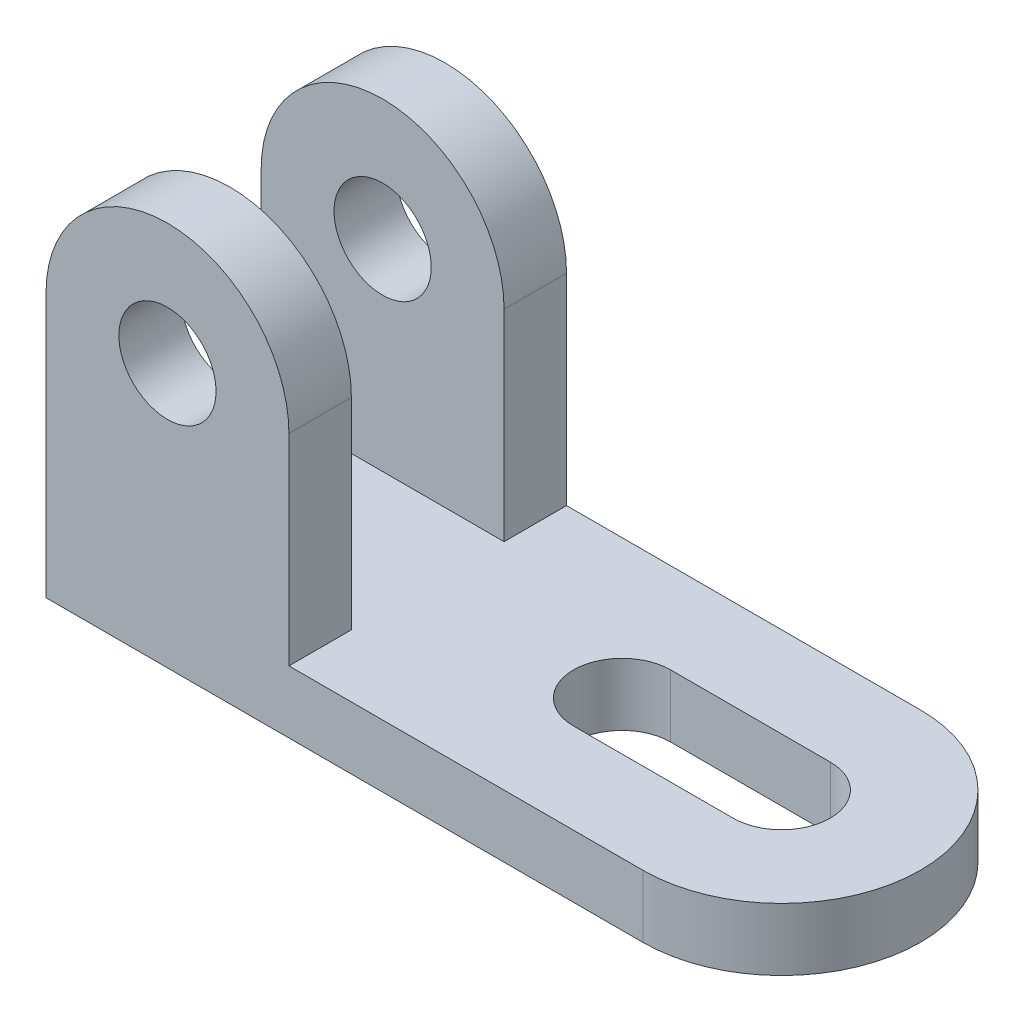
ISO-10303-21;
HEADER;
FILE_DESCRIPTION(('STEP AP214'),'2;1');
FILE_NAME('part.step','',(''),(''),'','','');
FILE_SCHEMA(('AUTOMOTIVE_DESIGN { 1 0 10303 214 1 1 1 1 }'));
ENDSEC;
DATA;
#1=APPLICATION_CONTEXT('core data for automotive mechanical design processes');
#2=APPLICATION_PROTOCOL_DEFINITION('international standard','automotive_design',2000,#1);
#3=PRODUCT_CONTEXT('',#1,'mechanical');
#4=PRODUCT('Part','Part','',(#3));
#5=PRODUCT_RELATED_PRODUCT_CATEGORY('part','',(#4));
#6=PRODUCT_DEFINITION_FORMATION('','',#4);
#7=PRODUCT_DEFINITION_CONTEXT('part definition',#1,'design');
#8=PRODUCT_DEFINITION('design','',#6,#7);
#9=PRODUCT_DEFINITION_SHAPE('','',#8);
#10=(LENGTH_UNIT() NAMED_UNIT(*) SI_UNIT(.MILLI.,.METRE.));
#11=(NAMED_UNIT(*) PLANE_ANGLE_UNIT() SI_UNIT($,.RADIAN.));
#12=(NAMED_UNIT(*) SI_UNIT($,.STERADIAN.) SOLID_ANGLE_UNIT());
#13=UNCERTAINTY_MEASURE_WITH_UNIT(LENGTH_MEASURE(1.E-05),#10,'distance_accuracy_value','');
#14=(GEOMETRIC_REPRESENTATION_CONTEXT(3) GLOBAL_UNCERTAINTY_ASSIGNED_CONTEXT((#13)) GLOBAL_UNIT_ASSIGNED_CONTEXT((#10,
#11,#12)) REPRESENTATION_CONTEXT('',''));
#15=CARTESIAN_POINT('',(0.,0.,0.));
#16=DIRECTION('',(0.,0.,1.));
#17=DIRECTION('',(1.,0.,0.));
#18=AXIS2_PLACEMENT_3D('',#15,#16,#17);
#19=CARTESIAN_POINT('',(0.,9.,0.));
#20=DIRECTION('',(0.,1.,0.));
#21=DIRECTION('',(0.,0.,1.));
#22=AXIS2_PLACEMENT_3D('',#19,#20,#21);
#23=PLANE('',#22);
#24=DIRECTION('',(0.,0.,-1.));
#25=VECTOR('',#24,1.);
#26=CARTESIAN_POINT('',(-51.,9.,0.));
#27=LINE('',#26,#25);
#28=CARTESIAN_POINT('',(-51.,9.,-11.));
#29=VERTEX_POINT('',#28);
#30=CARTESIAN_POINT('',(-51.,9.,-20.));
#31=VERTEX_POINT('',#30);
#32=EDGE_CURVE('E11',#29,#31,#27,.T.);
#33=ORIENTED_EDGE('',*,*,#32,.F.);
#34=DIRECTION('',(-1.,0.,0.));
#35=VECTOR('',#34,1.);
#36=CARTESIAN_POINT('',(0.,9.,-11.));
#37=LINE('',#36,#35);
#38=CARTESIAN_POINT('',(-86.,9.,-11.));
#39=VERTEX_POINT('',#38);
#40=EDGE_CURVE('E167',#29,#39,#37,.T.);
#41=ORIENTED_EDGE('',*,*,#40,.T.);
#42=DIRECTION('',(0.,0.,1.));
#43=VECTOR('',#42,1.);
#44=CARTESIAN_POINT('',(-86.,9.,-20.));
#45=LINE('',#44,#43);
#46=CARTESIAN_POINT('',(-86.,9.,11.));
#47=VERTEX_POINT('',#46);
#48=EDGE_CURVE('E149',#39,#47,#45,.T.);
#49=ORIENTED_EDGE('',*,*,#48,.T.);
#50=DIRECTION('',(1.,0.,0.));
#51=VECTOR('',#50,1.);
#52=CARTESIAN_POINT('',(0.,9.,11.));
#53=LINE('',#52,#51);
#54=CARTESIAN_POINT('',(-51.,9.,11.));
#55=VERTEX_POINT('',#54);
#56=EDGE_CURVE('E254',#47,#55,#53,.T.);
#57=ORIENTED_EDGE('',*,*,#56,.T.);
#58=DIRECTION('',(0.,0.,1.));
#59=VECTOR('',#58,1.);
#60=CARTESIAN_POINT('',(-51.,9.,0.));
#61=LINE('',#60,#59);
#62=CARTESIAN_POINT('',(-51.,9.,20.));
#63=VERTEX_POINT('',#62);
#64=EDGE_CURVE('E47',#55,#63,#61,.T.);
#65=ORIENTED_EDGE('',*,*,#64,.T.);
#66=DIRECTION('',(1.,0.,0.));
#67=VECTOR('',#66,1.);
#68=CARTESIAN_POINT('',(0.,9.,20.));
#69=LINE('',#68,#67);
#70=CARTESIAN_POINT('',(0.,9.,20.));
#71=VERTEX_POINT('',#70);
#72=EDGE_CURVE('E233',#63,#71,#69,.T.);
#73=ORIENTED_EDGE('',*,*,#72,.T.);
#74=CARTESIAN_POINT('',(0.,9.,0.));
#75=DIRECTION('',(0.,1.,0.));
#76=DIRECTION('',(0.,0.,1.));
#77=AXIS2_PLACEMENT_3D('',#74,#75,#76);
#78=CIRCLE('',#77,20.);
#79=CARTESIAN_POINT('',(0.,9.,-20.));
#80=VERTEX_POINT('',#79);
#81=EDGE_CURVE('E230',#71,#80,#78,.T.);
#82=ORIENTED_EDGE('',*,*,#81,.T.);
#83=DIRECTION('',(-1.,0.,0.));
#84=VECTOR('',#83,1.);
#85=CARTESIAN_POINT('',(0.,9.,-20.));
#86=LINE('',#85,#84);
#87=EDGE_CURVE('E228',#80,#31,#86,.T.);
#88=ORIENTED_EDGE('',*,*,#87,.T.);
#89=EDGE_LOOP('',(#33,#41,#49,#57,#65,#73,#82,#88));
#90=FACE_BOUND('',#89,.T.);
#91=DIRECTION('',(1.,0.,0.));
#92=VECTOR('',#91,1.);
#93=CARTESIAN_POINT('',(-23.,9.,7.));
#94=LINE('',#93,#92);
#95=CARTESIAN_POINT('',(-23.,9.,7.));
#96=VERTEX_POINT('',#95);
#97=CARTESIAN_POINT('',(0.,9.,7.));
#98=VERTEX_POINT('',#97);
#99=EDGE_CURVE('E196',#96,#98,#94,.T.);
#100=ORIENTED_EDGE('',*,*,#99,.F.);
#101=CARTESIAN_POINT('',(-23.,9.,0.));
#102=DIRECTION('',(0.,1.,0.));
#103=DIRECTION('',(0.,0.,1.));
#104=AXIS2_PLACEMENT_3D('',#101,#102,#103);
#105=CIRCLE('',#104,7.);
#106=CARTESIAN_POINT('',(-23.,9.,-7.));
#107=VERTEX_POINT('',#106);
#108=EDGE_CURVE('E198',#107,#96,#105,.T.);
#109=ORIENTED_EDGE('',*,*,#108,.F.);
#110=DIRECTION('',(-1.,0.,0.));
#111=VECTOR('',#110,1.);
#112=CARTESIAN_POINT('',(-23.,9.,-7.));
#113=LINE('',#112,#111);
#114=CARTESIAN_POINT('',(0.,9.,-7.));
#115=VERTEX_POINT('',#114);
#116=EDGE_CURVE('E204',#115,#107,#113,.T.);
#117=ORIENTED_EDGE('',*,*,#116,.F.);
#118=CARTESIAN_POINT('',(0.,9.,0.));
#119=DIRECTION('',(0.,1.,0.));
#120=DIRECTION('',(0.,0.,1.));
#121=AXIS2_PLACEMENT_3D('',#118,#119,#120);
#122=CIRCLE('',#121,7.);
#123=EDGE_CURVE('E203',#98,#115,#122,.T.);
#124=ORIENTED_EDGE('',*,*,#123,.F.);
#125=EDGE_LOOP('',(#100,#109,#117,#124));
#126=FACE_BOUND('',#125,.T.);
#127=ADVANCED_FACE('F41',(#90,#126),#23,.T.);
#128=CARTESIAN_POINT('',(0.,0.,0.));
#129=DIRECTION('',(0.,1.,0.));
#130=DIRECTION('',(0.,0.,1.));
#131=AXIS2_PLACEMENT_3D('',#128,#129,#130);
#132=PLANE('',#131);
#133=DIRECTION('',(0.,0.,1.));
#134=VECTOR('',#133,1.);
#135=CARTESIAN_POINT('',(-86.,0.,-20.));
#136=LINE('',#135,#134);
#137=CARTESIAN_POINT('',(-86.,0.,-20.));
#138=VERTEX_POINT('',#137);
#139=CARTESIAN_POINT('',(-86.,0.,20.));
#140=VERTEX_POINT('',#139);
#141=EDGE_CURVE('E245',#138,#140,#136,.T.);
#142=ORIENTED_EDGE('',*,*,#141,.F.);
#143=DIRECTION('',(-1.,0.,0.));
#144=VECTOR('',#143,1.);
#145=CARTESIAN_POINT('',(0.,0.,-20.));
#146=LINE('',#145,#144);
#147=CARTESIAN_POINT('',(0.,0.,-20.));
#148=VERTEX_POINT('',#147);
#149=EDGE_CURVE('E238',#148,#138,#146,.T.);
#150=ORIENTED_EDGE('',*,*,#149,.F.);
#151=CARTESIAN_POINT('',(0.,0.,0.));
#152=DIRECTION('',(0.,1.,0.));
#153=DIRECTION('',(0.,0.,1.));
#154=AXIS2_PLACEMENT_3D('',#151,#152,#153);
#155=CIRCLE('',#154,20.);
#156=CARTESIAN_POINT('',(0.,0.,20.));
#157=VERTEX_POINT('',#156);
#158=EDGE_CURVE('E227',#157,#148,#155,.T.);
#159=ORIENTED_EDGE('',*,*,#158,.F.);
#160=DIRECTION('',(1.,0.,0.));
#161=VECTOR('',#160,1.);
#162=CARTESIAN_POINT('',(0.,0.,20.));
#163=LINE('',#162,#161);
#164=EDGE_CURVE('E232',#140,#157,#163,.T.);
#165=ORIENTED_EDGE('',*,*,#164,.F.);
#166=EDGE_LOOP('',(#142,#150,#159,#165));
#167=FACE_BOUND('',#166,.T.);
#168=CARTESIAN_POINT('',(-23.,0.,0.));
#169=DIRECTION('',(0.,1.,0.));
#170=DIRECTION('',(0.,0.,1.));
#171=AXIS2_PLACEMENT_3D('',#168,#169,#170);
#172=CIRCLE('',#171,7.);
#173=CARTESIAN_POINT('',(-23.,0.,-7.));
#174=VERTEX_POINT('',#173);
#175=CARTESIAN_POINT('',(-23.,0.,7.));
#176=VERTEX_POINT('',#175);
#177=EDGE_CURVE('E191',#174,#176,#172,.T.);
#178=ORIENTED_EDGE('',*,*,#177,.T.);
#179=DIRECTION('',(1.,0.,0.));
#180=VECTOR('',#179,1.);
#181=CARTESIAN_POINT('',(-23.,0.,7.));
#182=LINE('',#181,#180);
#183=CARTESIAN_POINT('',(0.,0.,7.));
#184=VERTEX_POINT('',#183);
#185=EDGE_CURVE('E207',#176,#184,#182,.T.);
#186=ORIENTED_EDGE('',*,*,#185,.T.);
#187=CARTESIAN_POINT('',(0.,0.,0.));
#188=DIRECTION('',(0.,1.,0.));
#189=DIRECTION('',(0.,0.,1.));
#190=AXIS2_PLACEMENT_3D('',#187,#188,#189);
#191=CIRCLE('',#190,7.);
#192=CARTESIAN_POINT('',(0.,0.,-7.));
#193=VERTEX_POINT('',#192);
#194=EDGE_CURVE('E215',#184,#193,#191,.T.);
#195=ORIENTED_EDGE('',*,*,#194,.T.);
#196=DIRECTION('',(-1.,0.,0.));
#197=VECTOR('',#196,1.);
#198=CARTESIAN_POINT('',(-23.,0.,-7.));
#199=LINE('',#198,#197);
#200=EDGE_CURVE('E200',#193,#174,#199,.T.);
#201=ORIENTED_EDGE('',*,*,#200,.T.);
#202=EDGE_LOOP('',(#178,#186,#195,#201));
#203=FACE_BOUND('',#202,.T.);
#204=ADVANCED_FACE('F302',(#167,#203),#132,.F.);
#205=CARTESIAN_POINT('',(0.,9.,0.));
#206=DIRECTION('',(0.,-1.,0.));
#207=DIRECTION('',(0.,0.,-1.));
#208=AXIS2_PLACEMENT_3D('',#205,#206,#207);
#209=CYLINDRICAL_SURFACE('',#208,20.);
#210=ORIENTED_EDGE('',*,*,#158,.T.);
#211=DIRECTION('',(0.,-1.,0.));
#212=VECTOR('',#211,1.);
#213=CARTESIAN_POINT('',(0.,9.,-20.));
#214=LINE('',#213,#212);
#215=EDGE_CURVE('E252',#80,#148,#214,.T.);
#216=ORIENTED_EDGE('',*,*,#215,.F.);
#217=ORIENTED_EDGE('',*,*,#81,.F.);
#218=DIRECTION('',(0.,-1.,0.));
#219=VECTOR('',#218,1.);
#220=CARTESIAN_POINT('',(0.,9.,20.));
#221=LINE('',#220,#219);
#222=EDGE_CURVE('E240',#71,#157,#221,.T.);
#223=ORIENTED_EDGE('',*,*,#222,.T.);
#224=EDGE_LOOP('',(#210,#216,#217,#223));
#225=FACE_BOUND('',#224,.T.);
#226=ADVANCED_FACE('F43',(#225),#209,.T.);
#227=CARTESIAN_POINT('',(0.,9.,-20.));
#228=DIRECTION('',(0.,0.,1.));
#229=DIRECTION('',(1.,0.,0.));
#230=AXIS2_PLACEMENT_3D('',#227,#228,#229);
#231=PLANE('',#230);
#232=DIRECTION('',(0.,-1.,0.));
#233=VECTOR('',#232,1.);
#234=CARTESIAN_POINT('',(-86.,9.,-20.));
#235=LINE('',#234,#233);
#236=CARTESIAN_POINT('',(-86.,38.,-20.));
#237=VERTEX_POINT('',#236);
#238=EDGE_CURVE('E248',#237,#138,#235,.T.);
#239=ORIENTED_EDGE('',*,*,#238,.F.);
#240=CARTESIAN_POINT('',(-68.5,38.,-20.));
#241=DIRECTION('',(0.,0.,1.));
#242=DIRECTION('',(1.,0.,0.));
#243=AXIS2_PLACEMENT_3D('',#240,#241,#242);
#244=CIRCLE('',#243,17.5);
#245=CARTESIAN_POINT('',(-51.,38.,-20.));
#246=VERTEX_POINT('',#245);
#247=EDGE_CURVE('E162',#246,#237,#244,.T.);
#248=ORIENTED_EDGE('',*,*,#247,.F.);
#249=DIRECTION('',(0.,-1.,0.));
#250=VECTOR('',#249,1.);
#251=CARTESIAN_POINT('',(-51.,0.,-20.));
#252=LINE('',#251,#250);
#253=EDGE_CURVE('E276',#246,#31,#252,.T.);
#254=ORIENTED_EDGE('',*,*,#253,.T.);
#255=ORIENTED_EDGE('',*,*,#87,.F.);
#256=ORIENTED_EDGE('',*,*,#215,.T.);
#257=ORIENTED_EDGE('',*,*,#149,.T.);
#258=EDGE_LOOP('',(#239,#248,#254,#255,#256,#257));
#259=FACE_BOUND('',#258,.T.);
#260=CARTESIAN_POINT('',(-68.5,38.,-20.));
#261=DIRECTION('',(0.,0.,1.));
#262=DIRECTION('',(1.,0.,0.));
#263=AXIS2_PLACEMENT_3D('',#260,#261,#262);
#264=CIRCLE('',#263,7.);
#265=CARTESIAN_POINT('',(-61.5,38.,-20.));
#266=VERTEX_POINT('',#265);
#267=EDGE_CURVE('E285',#266,#266,#264,.T.);
#268=ORIENTED_EDGE('',*,*,#267,.T.);
#269=EDGE_LOOP('',(#268));
#270=FACE_BOUND('',#269,.T.);
#271=ADVANCED_FACE('F277',(#259,#270),#231,.F.);
#272=CARTESIAN_POINT('',(-86.,9.,-20.));
#273=DIRECTION('',(1.,0.,0.));
#274=DIRECTION('',(0.,0.,-1.));
#275=AXIS2_PLACEMENT_3D('',#272,#273,#274);
#276=PLANE('',#275);
#277=ORIENTED_EDGE('',*,*,#141,.T.);
#278=DIRECTION('',(0.,-1.,0.));
#279=VECTOR('',#278,1.);
#280=CARTESIAN_POINT('',(-86.,9.,20.));
#281=LINE('',#280,#279);
#282=CARTESIAN_POINT('',(-86.,38.,20.));
#283=VERTEX_POINT('',#282);
#284=EDGE_CURVE('E250',#283,#140,#281,.T.);
#285=ORIENTED_EDGE('',*,*,#284,.F.);
#286=DIRECTION('',(0.,0.,1.));
#287=VECTOR('',#286,1.);
#288=CARTESIAN_POINT('',(-86.,38.,11.));
#289=LINE('',#288,#287);
#290=CARTESIAN_POINT('',(-86.,38.,11.));
#291=VERTEX_POINT('',#290);
#292=EDGE_CURVE('E192',#291,#283,#289,.T.);
#293=ORIENTED_EDGE('',*,*,#292,.F.);
#294=DIRECTION('',(0.,1.,0.));
#295=VECTOR('',#294,1.);
#296=CARTESIAN_POINT('',(-86.,0.,11.));
#297=LINE('',#296,#295);
#298=EDGE_CURVE('E176',#47,#291,#297,.T.);
#299=ORIENTED_EDGE('',*,*,#298,.F.);
#300=ORIENTED_EDGE('',*,*,#48,.F.);
#301=DIRECTION('',(0.,1.,0.));
#302=VECTOR('',#301,1.);
#303=CARTESIAN_POINT('',(-86.,0.,-11.));
#304=LINE('',#303,#302);
#305=CARTESIAN_POINT('',(-86.,38.,-11.));
#306=VERTEX_POINT('',#305);
#307=EDGE_CURVE('E57',#39,#306,#304,.T.);
#308=ORIENTED_EDGE('',*,*,#307,.T.);
#309=DIRECTION('',(0.,0.,-1.));
#310=VECTOR('',#309,1.);
#311=CARTESIAN_POINT('',(-86.,38.,-11.));
#312=LINE('',#311,#310);
#313=EDGE_CURVE('E148',#306,#237,#312,.T.);
#314=ORIENTED_EDGE('',*,*,#313,.T.);
#315=ORIENTED_EDGE('',*,*,#238,.T.);
#316=EDGE_LOOP('',(#277,#285,#293,#299,#300,#308,#314,#315));
#317=FACE_BOUND('',#316,.T.);
#318=ADVANCED_FACE('F141',(#317),#276,.F.);
#319=CARTESIAN_POINT('',(0.,9.,20.));
#320=DIRECTION('',(0.,0.,-1.));
#321=DIRECTION('',(-1.,0.,0.));
#322=AXIS2_PLACEMENT_3D('',#319,#320,#321);
#323=PLANE('',#322);
#324=ORIENTED_EDGE('',*,*,#72,.F.);
#325=DIRECTION('',(0.,-1.,0.));
#326=VECTOR('',#325,1.);
#327=CARTESIAN_POINT('',(-51.,0.,20.));
#328=LINE('',#327,#326);
#329=CARTESIAN_POINT('',(-51.,38.,20.));
#330=VERTEX_POINT('',#329);
#331=EDGE_CURVE('E174',#330,#63,#328,.T.);
#332=ORIENTED_EDGE('',*,*,#331,.F.);
#333=CARTESIAN_POINT('',(-68.5,38.,20.));
#334=DIRECTION('',(0.,0.,1.));
#335=DIRECTION('',(1.,0.,0.));
#336=AXIS2_PLACEMENT_3D('',#333,#334,#335);
#337=CIRCLE('',#336,17.5);
#338=EDGE_CURVE('E187',#330,#283,#337,.T.);
#339=ORIENTED_EDGE('',*,*,#338,.T.);
#340=ORIENTED_EDGE('',*,*,#284,.T.);
#341=ORIENTED_EDGE('',*,*,#164,.T.);
#342=ORIENTED_EDGE('',*,*,#222,.F.);
#343=EDGE_LOOP('',(#324,#332,#339,#340,#341,#342));
#344=FACE_BOUND('',#343,.T.);
#345=CARTESIAN_POINT('',(-68.5,38.,20.));
#346=DIRECTION('',(0.,0.,1.));
#347=DIRECTION('',(1.,0.,0.));
#348=AXIS2_PLACEMENT_3D('',#345,#346,#347);
#349=CIRCLE('',#348,7.);
#350=CARTESIAN_POINT('',(-61.5,38.,20.));
#351=VERTEX_POINT('',#350);
#352=EDGE_CURVE('E177',#351,#351,#349,.T.);
#353=ORIENTED_EDGE('',*,*,#352,.F.);
#354=EDGE_LOOP('',(#353));
#355=FACE_BOUND('',#354,.T.);
#356=ADVANCED_FACE('F266',(#344,#355),#323,.F.);
#357=CARTESIAN_POINT('',(-23.,9.,0.));
#358=DIRECTION('',(0.,-1.,0.));
#359=DIRECTION('',(0.,0.,-1.));
#360=AXIS2_PLACEMENT_3D('',#357,#358,#359);
#361=CYLINDRICAL_SURFACE('',#360,7.);
#362=ORIENTED_EDGE('',*,*,#177,.F.);
#363=DIRECTION('',(0.,-1.,0.));
#364=VECTOR('',#363,1.);
#365=CARTESIAN_POINT('',(-23.,9.,-7.));
#366=LINE('',#365,#364);
#367=EDGE_CURVE('E206',#107,#174,#366,.T.);
#368=ORIENTED_EDGE('',*,*,#367,.F.);
#369=ORIENTED_EDGE('',*,*,#108,.T.);
#370=DIRECTION('',(0.,-1.,0.));
#371=VECTOR('',#370,1.);
#372=CARTESIAN_POINT('',(-23.,9.,7.));
#373=LINE('',#372,#371);
#374=EDGE_CURVE('E224',#96,#176,#373,.T.);
#375=ORIENTED_EDGE('',*,*,#374,.T.);
#376=EDGE_LOOP('',(#362,#368,#369,#375));
#377=FACE_BOUND('',#376,.T.);
#378=ADVANCED_FACE('F310',(#377),#361,.F.);
#379=CARTESIAN_POINT('',(-23.,9.,7.));
#380=DIRECTION('',(0.,0.,-1.));
#381=DIRECTION('',(-1.,0.,0.));
#382=AXIS2_PLACEMENT_3D('',#379,#380,#381);
#383=PLANE('',#382);
#384=ORIENTED_EDGE('',*,*,#185,.F.);
#385=ORIENTED_EDGE('',*,*,#374,.F.);
#386=ORIENTED_EDGE('',*,*,#99,.T.);
#387=DIRECTION('',(0.,-1.,0.));
#388=VECTOR('',#387,1.);
#389=CARTESIAN_POINT('',(0.,9.,7.));
#390=LINE('',#389,#388);
#391=EDGE_CURVE('E222',#98,#184,#390,.T.);
#392=ORIENTED_EDGE('',*,*,#391,.T.);
#393=EDGE_LOOP('',(#384,#385,#386,#392));
#394=FACE_BOUND('',#393,.T.);
#395=ADVANCED_FACE('F328',(#394),#383,.T.);
#396=CARTESIAN_POINT('',(0.,9.,0.));
#397=DIRECTION('',(0.,-1.,0.));
#398=DIRECTION('',(0.,0.,-1.));
#399=AXIS2_PLACEMENT_3D('',#396,#397,#398);
#400=CYLINDRICAL_SURFACE('',#399,7.);
#401=ORIENTED_EDGE('',*,*,#194,.F.);
#402=ORIENTED_EDGE('',*,*,#391,.F.);
#403=ORIENTED_EDGE('',*,*,#123,.T.);
#404=DIRECTION('',(0.,-1.,0.));
#405=VECTOR('',#404,1.);
#406=CARTESIAN_POINT('',(0.,9.,-7.));
#407=LINE('',#406,#405);
#408=EDGE_CURVE('E218',#115,#193,#407,.T.);
#409=ORIENTED_EDGE('',*,*,#408,.T.);
#410=EDGE_LOOP('',(#401,#402,#403,#409));
#411=FACE_BOUND('',#410,.T.);
#412=ADVANCED_FACE('F339',(#411),#400,.F.);
#413=CARTESIAN_POINT('',(-23.,9.,-7.));
#414=DIRECTION('',(0.,0.,1.));
#415=DIRECTION('',(1.,0.,0.));
#416=AXIS2_PLACEMENT_3D('',#413,#414,#415);
#417=PLANE('',#416);
#418=ORIENTED_EDGE('',*,*,#200,.F.);
#419=ORIENTED_EDGE('',*,*,#408,.F.);
#420=ORIENTED_EDGE('',*,*,#116,.T.);
#421=ORIENTED_EDGE('',*,*,#367,.T.);
#422=EDGE_LOOP('',(#418,#419,#420,#421));
#423=FACE_BOUND('',#422,.T.);
#424=ADVANCED_FACE('F347',(#423),#417,.T.);
#425=CARTESIAN_POINT('',(-51.,0.,11.));
#426=DIRECTION('',(-1.,0.,0.));
#427=DIRECTION('',(0.,0.,1.));
#428=AXIS2_PLACEMENT_3D('',#425,#426,#427);
#429=PLANE('',#428);
#430=ORIENTED_EDGE('',*,*,#64,.F.);
#431=DIRECTION('',(0.,-1.,0.));
#432=VECTOR('',#431,1.);
#433=CARTESIAN_POINT('',(-51.,0.,11.));
#434=LINE('',#433,#432);
#435=CARTESIAN_POINT('',(-51.,38.,11.));
#436=VERTEX_POINT('',#435);
#437=EDGE_CURVE('E61',#436,#55,#434,.T.);
#438=ORIENTED_EDGE('',*,*,#437,.F.);
#439=DIRECTION('',(0.,0.,1.));
#440=VECTOR('',#439,1.);
#441=CARTESIAN_POINT('',(-51.,38.,11.));
#442=LINE('',#441,#440);
#443=EDGE_CURVE('E184',#436,#330,#442,.T.);
#444=ORIENTED_EDGE('',*,*,#443,.T.);
#445=ORIENTED_EDGE('',*,*,#331,.T.);
#446=EDGE_LOOP('',(#430,#438,#444,#445));
#447=FACE_BOUND('',#446,.T.);
#448=ADVANCED_FACE('F353',(#447),#429,.F.);
#449=CARTESIAN_POINT('',(-68.5,38.,11.));
#450=DIRECTION('',(0.,0.,1.));
#451=DIRECTION('',(1.,0.,0.));
#452=AXIS2_PLACEMENT_3D('',#449,#450,#451);
#453=CYLINDRICAL_SURFACE('',#452,17.5);
#454=ORIENTED_EDGE('',*,*,#338,.F.);
#455=ORIENTED_EDGE('',*,*,#443,.F.);
#456=CARTESIAN_POINT('',(-68.5,38.,11.));
#457=DIRECTION('',(0.,0.,1.));
#458=DIRECTION('',(1.,0.,0.));
#459=AXIS2_PLACEMENT_3D('',#456,#457,#458);
#460=CIRCLE('',#459,17.5);
#461=EDGE_CURVE('E173',#436,#291,#460,.T.);
#462=ORIENTED_EDGE('',*,*,#461,.T.);
#463=ORIENTED_EDGE('',*,*,#292,.T.);
#464=EDGE_LOOP('',(#454,#455,#462,#463));
#465=FACE_BOUND('',#464,.T.);
#466=ADVANCED_FACE('F364',(#465),#453,.T.);
#467=CARTESIAN_POINT('',(-68.5,38.,11.));
#468=DIRECTION('',(0.,0.,1.));
#469=DIRECTION('',(1.,0.,0.));
#470=AXIS2_PLACEMENT_3D('',#467,#468,#469);
#471=CYLINDRICAL_SURFACE('',#470,7.);
#472=CARTESIAN_POINT('',(-68.5,38.,11.));
#473=DIRECTION('',(0.,0.,1.));
#474=DIRECTION('',(1.,0.,0.));
#475=AXIS2_PLACEMENT_3D('',#472,#473,#474);
#476=CIRCLE('',#475,7.);
#477=CARTESIAN_POINT('',(-61.5,38.,11.));
#478=VERTEX_POINT('',#477);
#479=EDGE_CURVE('E182',#478,#478,#476,.T.);
#480=ORIENTED_EDGE('',*,*,#479,.F.);
#481=EDGE_LOOP('',(#480));
#482=FACE_BOUND('',#481,.T.);
#483=ORIENTED_EDGE('',*,*,#352,.T.);
#484=EDGE_LOOP('',(#483));
#485=FACE_BOUND('',#484,.T.);
#486=ADVANCED_FACE('F299',(#482,#485),#471,.F.);
#487=CARTESIAN_POINT('',(0.,0.,11.));
#488=DIRECTION('',(0.,0.,1.));
#489=DIRECTION('',(1.,0.,0.));
#490=AXIS2_PLACEMENT_3D('',#487,#488,#489);
#491=PLANE('',#490);
#492=ORIENTED_EDGE('',*,*,#56,.F.);
#493=ORIENTED_EDGE('',*,*,#298,.T.);
#494=ORIENTED_EDGE('',*,*,#461,.F.);
#495=ORIENTED_EDGE('',*,*,#437,.T.);
#496=EDGE_LOOP('',(#492,#493,#494,#495));
#497=FACE_BOUND('',#496,.T.);
#498=ORIENTED_EDGE('',*,*,#479,.T.);
#499=EDGE_LOOP('',(#498));
#500=FACE_BOUND('',#499,.T.);
#501=ADVANCED_FACE('F286',(#497,#500),#491,.F.);
#502=CARTESIAN_POINT('',(-51.,0.,-11.));
#503=DIRECTION('',(1.,0.,0.));
#504=DIRECTION('',(0.,0.,-1.));
#505=AXIS2_PLACEMENT_3D('',#502,#503,#504);
#506=PLANE('',#505);
#507=DIRECTION('',(0.,-1.,0.));
#508=VECTOR('',#507,1.);
#509=CARTESIAN_POINT('',(-51.,0.,-11.));
#510=LINE('',#509,#508);
#511=CARTESIAN_POINT('',(-51.,38.,-11.));
#512=VERTEX_POINT('',#511);
#513=EDGE_CURVE('E151',#512,#29,#510,.T.);
#514=ORIENTED_EDGE('',*,*,#513,.T.);
#515=ORIENTED_EDGE('',*,*,#32,.T.);
#516=ORIENTED_EDGE('',*,*,#253,.F.);
#517=DIRECTION('',(0.,0.,-1.));
#518=VECTOR('',#517,1.);
#519=CARTESIAN_POINT('',(-51.,38.,-11.));
#520=LINE('',#519,#518);
#521=EDGE_CURVE('E163',#512,#246,#520,.T.);
#522=ORIENTED_EDGE('',*,*,#521,.F.);
#523=EDGE_LOOP('',(#514,#515,#516,#522));
#524=FACE_BOUND('',#523,.T.);
#525=ADVANCED_FACE('F290',(#524),#506,.T.);
#526=CARTESIAN_POINT('',(-68.5,38.,-11.));
#527=DIRECTION('',(0.,0.,-1.));
#528=DIRECTION('',(-1.,0.,0.));
#529=AXIS2_PLACEMENT_3D('',#526,#527,#528);
#530=CYLINDRICAL_SURFACE('',#529,17.5);
#531=ORIENTED_EDGE('',*,*,#247,.T.);
#532=ORIENTED_EDGE('',*,*,#313,.F.);
#533=CARTESIAN_POINT('',(-68.5,38.,-11.));
#534=DIRECTION('',(0.,0.,1.));
#535=DIRECTION('',(1.,0.,0.));
#536=AXIS2_PLACEMENT_3D('',#533,#534,#535);
#537=CIRCLE('',#536,17.5);
#538=EDGE_CURVE('E147',#512,#306,#537,.T.);
#539=ORIENTED_EDGE('',*,*,#538,.F.);
#540=ORIENTED_EDGE('',*,*,#521,.T.);
#541=EDGE_LOOP('',(#531,#532,#539,#540));
#542=FACE_BOUND('',#541,.T.);
#543=ADVANCED_FACE('F161',(#542),#530,.T.);
#544=CARTESIAN_POINT('',(-68.5,38.,-11.));
#545=DIRECTION('',(0.,0.,-1.));
#546=DIRECTION('',(-1.,0.,0.));
#547=AXIS2_PLACEMENT_3D('',#544,#545,#546);
#548=CYLINDRICAL_SURFACE('',#547,7.);
#549=CARTESIAN_POINT('',(-68.5,38.,-11.));
#550=DIRECTION('',(0.,0.,1.));
#551=DIRECTION('',(1.,0.,0.));
#552=AXIS2_PLACEMENT_3D('',#549,#550,#551);
#553=CIRCLE('',#552,7.);
#554=CARTESIAN_POINT('',(-61.5,38.,-11.));
#555=VERTEX_POINT('',#554);
#556=EDGE_CURVE('E157',#555,#555,#553,.T.);
#557=ORIENTED_EDGE('',*,*,#556,.T.);
#558=EDGE_LOOP('',(#557));
#559=FACE_BOUND('',#558,.T.);
#560=ORIENTED_EDGE('',*,*,#267,.F.);
#561=EDGE_LOOP('',(#560));
#562=FACE_BOUND('',#561,.T.);
#563=ADVANCED_FACE('F293',(#559,#562),#548,.F.);
#564=CARTESIAN_POINT('',(0.,0.,-11.));
#565=DIRECTION('',(0.,0.,-1.));
#566=DIRECTION('',(1.,0.,0.));
#567=AXIS2_PLACEMENT_3D('',#564,#565,#566);
#568=PLANE('',#567);
#569=ORIENTED_EDGE('',*,*,#40,.F.);
#570=ORIENTED_EDGE('',*,*,#513,.F.);
#571=ORIENTED_EDGE('',*,*,#538,.T.);
#572=ORIENTED_EDGE('',*,*,#307,.F.);
#573=EDGE_LOOP('',(#569,#570,#571,#572));
#574=FACE_BOUND('',#573,.T.);
#575=ORIENTED_EDGE('',*,*,#556,.F.);
#576=EDGE_LOOP('',(#575));
#577=FACE_BOUND('',#576,.T.);
#578=ADVANCED_FACE('F154',(#574,#577),#568,.F.);
#579=CLOSED_SHELL('',(#127,#204,#226,#271,#318,#356,#378,#395,#412,#424,#448,#466,#486,#501,
#525,#543,#563,#578));
#580=MANIFOLD_SOLID_BREP('B2',#579);
#581=ADVANCED_BREP_SHAPE_REPRESENTATION('',(#18,#580),#14);
#582=SHAPE_DEFINITION_REPRESENTATION(#9,#581);
ENDSEC;
END-ISO-10303-21;
